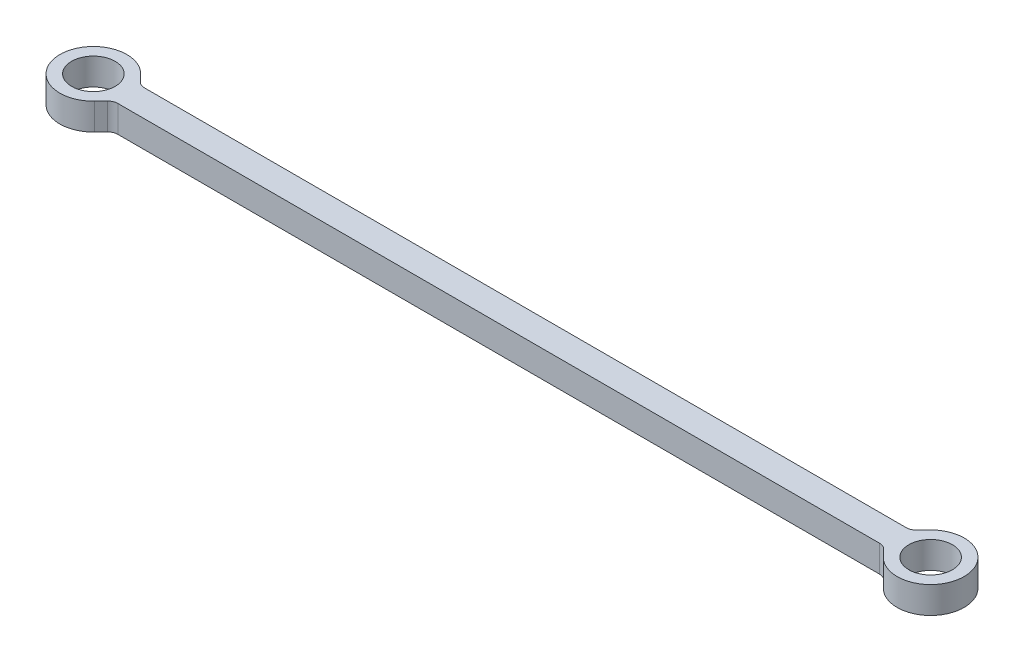
ISO-10303-21;
HEADER;
FILE_DESCRIPTION(('STEP AP214'),'2;1');
FILE_NAME('part.step','',(''),(''),'','','');
FILE_SCHEMA(('AUTOMOTIVE_DESIGN { 1 0 10303 214 1 1 1 1 }'));
ENDSEC;
DATA;
#1=APPLICATION_CONTEXT('core data for automotive mechanical design processes');
#2=APPLICATION_PROTOCOL_DEFINITION('international standard','automotive_design',2000,#1);
#3=PRODUCT_CONTEXT('',#1,'mechanical');
#4=PRODUCT('Part','Part','',(#3));
#5=PRODUCT_RELATED_PRODUCT_CATEGORY('part','',(#4));
#6=PRODUCT_DEFINITION_FORMATION('','',#4);
#7=PRODUCT_DEFINITION_CONTEXT('part definition',#1,'design');
#8=PRODUCT_DEFINITION('design','',#6,#7);
#9=PRODUCT_DEFINITION_SHAPE('','',#8);
#10=(LENGTH_UNIT() NAMED_UNIT(*) SI_UNIT(.MILLI.,.METRE.));
#11=(NAMED_UNIT(*) PLANE_ANGLE_UNIT() SI_UNIT($,.RADIAN.));
#12=(NAMED_UNIT(*) SI_UNIT($,.STERADIAN.) SOLID_ANGLE_UNIT());
#13=UNCERTAINTY_MEASURE_WITH_UNIT(LENGTH_MEASURE(1.E-05),#10,'distance_accuracy_value','');
#14=(GEOMETRIC_REPRESENTATION_CONTEXT(3) GLOBAL_UNCERTAINTY_ASSIGNED_CONTEXT((#13)) GLOBAL_UNIT_ASSIGNED_CONTEXT((#10,
#11,#12)) REPRESENTATION_CONTEXT('',''));
#15=CARTESIAN_POINT('',(0.,0.,0.));
#16=DIRECTION('',(0.,0.,1.));
#17=DIRECTION('',(1.,0.,0.));
#18=AXIS2_PLACEMENT_3D('',#15,#16,#17);
#19=CARTESIAN_POINT('',(0.,8.,0.));
#20=DIRECTION('',(0.,-1.,0.));
#21=DIRECTION('',(0.,0.,-1.));
#22=AXIS2_PLACEMENT_3D('',#19,#20,#21);
#23=CYLINDRICAL_SURFACE('',#22,10.);
#24=CARTESIAN_POINT('',(0.,0.,0.));
#25=DIRECTION('',(0.,-1.,0.));
#26=DIRECTION('',(0.,0.,-1.));
#27=AXIS2_PLACEMENT_3D('',#24,#25,#26);
#28=CIRCLE('',#27,10.);
#29=CARTESIAN_POINT('',(7.24137931034485,0.,6.89655172413791));
#30=VERTEX_POINT('',#29);
#31=CARTESIAN_POINT('',(7.24137931034484,0.,-6.89655172413792));
#32=VERTEX_POINT('',#31);
#33=EDGE_CURVE('E160',#30,#32,#28,.T.);
#34=ORIENTED_EDGE('',*,*,#33,.F.);
#35=DIRECTION('',(0.,-1.,0.));
#36=VECTOR('',#35,1.);
#37=CARTESIAN_POINT('',(7.24137931034485,8.,6.89655172413791));
#38=LINE('',#37,#36);
#39=CARTESIAN_POINT('',(7.24137931034485,8.,6.89655172413791));
#40=VERTEX_POINT('',#39);
#41=EDGE_CURVE('E11',#40,#30,#38,.T.);
#42=ORIENTED_EDGE('',*,*,#41,.F.);
#43=CARTESIAN_POINT('',(0.,8.,0.));
#44=DIRECTION('',(0.,-1.,0.));
#45=DIRECTION('',(0.,0.,-1.));
#46=AXIS2_PLACEMENT_3D('',#43,#44,#45);
#47=CIRCLE('',#46,10.);
#48=CARTESIAN_POINT('',(7.24137931034484,8.,-6.89655172413792));
#49=VERTEX_POINT('',#48);
#50=EDGE_CURVE('E193',#40,#49,#47,.T.);
#51=ORIENTED_EDGE('',*,*,#50,.T.);
#52=DIRECTION('',(0.,-1.,0.));
#53=VECTOR('',#52,1.);
#54=CARTESIAN_POINT('',(7.24137931034484,8.,-6.89655172413792));
#55=LINE('',#54,#53);
#56=EDGE_CURVE('E42',#49,#32,#55,.T.);
#57=ORIENTED_EDGE('',*,*,#56,.T.);
#58=EDGE_LOOP('',(#34,#42,#51,#57));
#59=FACE_BOUND('',#58,.T.);
#60=ADVANCED_FACE('F39',(#59),#23,.T.);
#61=CARTESIAN_POINT('',(9.11330049261083,8.,4.93103448275862));
#62=DIRECTION('',(0.724137931034485,0.,0.689655172413791));
#63=DIRECTION('',(0.689655172413791,0.,-0.724137931034485));
#64=AXIS2_PLACEMENT_3D('',#61,#62,#63);
#65=PLANE('',#64);
#66=DIRECTION('',(-0.689655172413791,0.,0.724137931034485));
#67=VECTOR('',#66,1.);
#68=CARTESIAN_POINT('',(9.11330049261083,0.,4.93103448275862));
#69=LINE('',#68,#67);
#70=CARTESIAN_POINT('',(9.11330049261083,0.,4.93103448275862));
#71=VERTEX_POINT('',#70);
#72=EDGE_CURVE('E191',#71,#30,#69,.T.);
#73=ORIENTED_EDGE('',*,*,#72,.F.);
#74=DIRECTION('',(0.,-1.,0.));
#75=VECTOR('',#74,1.);
#76=CARTESIAN_POINT('',(9.11330049261083,8.,4.93103448275862));
#77=LINE('',#76,#75);
#78=CARTESIAN_POINT('',(9.11330049261083,8.,4.93103448275862));
#79=VERTEX_POINT('',#78);
#80=EDGE_CURVE('E48',#79,#71,#77,.T.);
#81=ORIENTED_EDGE('',*,*,#80,.F.);
#82=DIRECTION('',(-0.689655172413791,0.,0.724137931034485));
#83=VECTOR('',#82,1.);
#84=CARTESIAN_POINT('',(9.11330049261083,8.,4.93103448275862));
#85=LINE('',#84,#83);
#86=EDGE_CURVE('E150',#79,#40,#85,.T.);
#87=ORIENTED_EDGE('',*,*,#86,.T.);
#88=ORIENTED_EDGE('',*,*,#41,.T.);
#89=EDGE_LOOP('',(#73,#81,#87,#88));
#90=FACE_BOUND('',#89,.T.);
#91=ADVANCED_FACE('F213',(#90),#65,.T.);
#92=CARTESIAN_POINT('',(11.2857142857143,8.,7.));
#93=DIRECTION('',(0.,-1.,0.));
#94=DIRECTION('',(0.,0.,-1.));
#95=AXIS2_PLACEMENT_3D('',#92,#93,#94);
#96=CYLINDRICAL_SURFACE('',#95,3.);
#97=CARTESIAN_POINT('',(11.2857142857143,0.,7.));
#98=DIRECTION('',(0.,1.,0.));
#99=DIRECTION('',(0.,0.,1.));
#100=AXIS2_PLACEMENT_3D('',#97,#98,#99);
#101=CIRCLE('',#100,3.);
#102=CARTESIAN_POINT('',(11.2857142857143,0.,4.));
#103=VERTEX_POINT('',#102);
#104=EDGE_CURVE('E137',#103,#71,#101,.T.);
#105=ORIENTED_EDGE('',*,*,#104,.F.);
#106=DIRECTION('',(0.,-1.,0.));
#107=VECTOR('',#106,1.);
#108=CARTESIAN_POINT('',(11.2857142857143,8.,4.));
#109=LINE('',#108,#107);
#110=CARTESIAN_POINT('',(11.2857142857143,8.,4.));
#111=VERTEX_POINT('',#110);
#112=EDGE_CURVE('E132',#111,#103,#109,.T.);
#113=ORIENTED_EDGE('',*,*,#112,.F.);
#114=CARTESIAN_POINT('',(11.2857142857143,8.,7.));
#115=DIRECTION('',(0.,1.,0.));
#116=DIRECTION('',(0.,0.,1.));
#117=AXIS2_PLACEMENT_3D('',#114,#115,#116);
#118=CIRCLE('',#117,3.);
#119=EDGE_CURVE('E135',#111,#79,#118,.T.);
#120=ORIENTED_EDGE('',*,*,#119,.T.);
#121=ORIENTED_EDGE('',*,*,#80,.T.);
#122=EDGE_LOOP('',(#105,#113,#120,#121));
#123=FACE_BOUND('',#122,.T.);
#124=ADVANCED_FACE('F134',(#123),#96,.F.);
#125=CARTESIAN_POINT('',(238.714285714285,8.,4.));
#126=DIRECTION('',(0.,0.,1.));
#127=DIRECTION('',(1.,0.,0.));
#128=AXIS2_PLACEMENT_3D('',#125,#126,#127);
#129=PLANE('',#128);
#130=DIRECTION('',(-1.,0.,0.));
#131=VECTOR('',#130,1.);
#132=CARTESIAN_POINT('',(238.714285714285,0.,4.));
#133=LINE('',#132,#131);
#134=CARTESIAN_POINT('',(238.714285714285,0.,4.));
#135=VERTEX_POINT('',#134);
#136=EDGE_CURVE('E188',#135,#103,#133,.T.);
#137=ORIENTED_EDGE('',*,*,#136,.F.);
#138=DIRECTION('',(0.,-1.,0.));
#139=VECTOR('',#138,1.);
#140=CARTESIAN_POINT('',(238.714285714285,8.,4.));
#141=LINE('',#140,#139);
#142=CARTESIAN_POINT('',(238.714285714285,8.,4.));
#143=VERTEX_POINT('',#142);
#144=EDGE_CURVE('E142',#143,#135,#141,.T.);
#145=ORIENTED_EDGE('',*,*,#144,.F.);
#146=DIRECTION('',(-1.,0.,0.));
#147=VECTOR('',#146,1.);
#148=CARTESIAN_POINT('',(238.714285714285,8.,4.));
#149=LINE('',#148,#147);
#150=EDGE_CURVE('E148',#143,#111,#149,.T.);
#151=ORIENTED_EDGE('',*,*,#150,.T.);
#152=ORIENTED_EDGE('',*,*,#112,.T.);
#153=EDGE_LOOP('',(#137,#145,#151,#152));
#154=FACE_BOUND('',#153,.T.);
#155=ADVANCED_FACE('F152',(#154),#129,.T.);
#156=CARTESIAN_POINT('',(238.714285714286,8.,7.));
#157=DIRECTION('',(0.,-1.,0.));
#158=DIRECTION('',(0.,0.,-1.));
#159=AXIS2_PLACEMENT_3D('',#156,#157,#158);
#160=CYLINDRICAL_SURFACE('',#159,2.99999999999984);
#161=CARTESIAN_POINT('',(238.714285714286,0.,7.));
#162=DIRECTION('',(0.,1.,0.));
#163=DIRECTION('',(0.,0.,1.));
#164=AXIS2_PLACEMENT_3D('',#161,#162,#163);
#165=CIRCLE('',#164,2.99999999999984);
#166=CARTESIAN_POINT('',(240.886699507389,0.,4.93103448275852));
#167=VERTEX_POINT('',#166);
#168=EDGE_CURVE('E185',#167,#135,#165,.T.);
#169=ORIENTED_EDGE('',*,*,#168,.F.);
#170=DIRECTION('',(0.,-1.,0.));
#171=VECTOR('',#170,1.);
#172=CARTESIAN_POINT('',(240.886699507389,8.,4.93103448275852));
#173=LINE('',#172,#171);
#174=CARTESIAN_POINT('',(240.886699507389,8.,4.93103448275852));
#175=VERTEX_POINT('',#174);
#176=EDGE_CURVE('E197',#175,#167,#173,.T.);
#177=ORIENTED_EDGE('',*,*,#176,.F.);
#178=CARTESIAN_POINT('',(238.714285714286,8.,7.));
#179=DIRECTION('',(0.,1.,0.));
#180=DIRECTION('',(0.,0.,1.));
#181=AXIS2_PLACEMENT_3D('',#178,#179,#180);
#182=CIRCLE('',#181,2.99999999999984);
#183=EDGE_CURVE('E153',#175,#143,#182,.T.);
#184=ORIENTED_EDGE('',*,*,#183,.T.);
#185=ORIENTED_EDGE('',*,*,#144,.T.);
#186=EDGE_LOOP('',(#169,#177,#184,#185));
#187=FACE_BOUND('',#186,.T.);
#188=ADVANCED_FACE('F226',(#187),#160,.F.);
#189=CARTESIAN_POINT('',(242.758620689655,8.,6.89655172413791));
#190=DIRECTION('',(-0.724137931034476,0.,0.6896551724138));
#191=DIRECTION('',(0.6896551724138,0.,0.724137931034476));
#192=AXIS2_PLACEMENT_3D('',#189,#190,#191);
#193=PLANE('',#192);
#194=DIRECTION('',(-0.6896551724138,0.,-0.724137931034476));
#195=VECTOR('',#194,1.);
#196=CARTESIAN_POINT('',(242.758620689655,0.,6.89655172413791));
#197=LINE('',#196,#195);
#198=CARTESIAN_POINT('',(242.758620689655,0.,6.89655172413791));
#199=VERTEX_POINT('',#198);
#200=EDGE_CURVE('E182',#199,#167,#197,.T.);
#201=ORIENTED_EDGE('',*,*,#200,.F.);
#202=DIRECTION('',(0.,-1.,0.));
#203=VECTOR('',#202,1.);
#204=CARTESIAN_POINT('',(242.758620689655,8.,6.89655172413791));
#205=LINE('',#204,#203);
#206=CARTESIAN_POINT('',(242.758620689655,8.,6.89655172413791));
#207=VERTEX_POINT('',#206);
#208=EDGE_CURVE('E199',#207,#199,#205,.T.);
#209=ORIENTED_EDGE('',*,*,#208,.F.);
#210=DIRECTION('',(-0.6896551724138,0.,-0.724137931034476));
#211=VECTOR('',#210,1.);
#212=CARTESIAN_POINT('',(242.758620689655,8.,6.89655172413791));
#213=LINE('',#212,#211);
#214=EDGE_CURVE('E155',#207,#175,#213,.T.);
#215=ORIENTED_EDGE('',*,*,#214,.T.);
#216=ORIENTED_EDGE('',*,*,#176,.T.);
#217=EDGE_LOOP('',(#201,#209,#215,#216));
#218=FACE_BOUND('',#217,.T.);
#219=ADVANCED_FACE('F229',(#218),#193,.T.);
#220=CARTESIAN_POINT('',(250.,8.,0.));
#221=DIRECTION('',(0.,-1.,0.));
#222=DIRECTION('',(0.,0.,-1.));
#223=AXIS2_PLACEMENT_3D('',#220,#221,#222);
#224=CYLINDRICAL_SURFACE('',#223,10.0000000000001);
#225=CARTESIAN_POINT('',(250.,0.,0.));
#226=DIRECTION('',(0.,-1.,0.));
#227=DIRECTION('',(0.,0.,-1.));
#228=AXIS2_PLACEMENT_3D('',#225,#226,#227);
#229=CIRCLE('',#228,10.0000000000001);
#230=CARTESIAN_POINT('',(242.758620689655,0.,-6.89655172413791));
#231=VERTEX_POINT('',#230);
#232=EDGE_CURVE('E179',#231,#199,#229,.T.);
#233=ORIENTED_EDGE('',*,*,#232,.F.);
#234=DIRECTION('',(0.,-1.,0.));
#235=VECTOR('',#234,1.);
#236=CARTESIAN_POINT('',(242.758620689655,8.,-6.89655172413791));
#237=LINE('',#236,#235);
#238=CARTESIAN_POINT('',(242.758620689655,8.,-6.89655172413791));
#239=VERTEX_POINT('',#238);
#240=EDGE_CURVE('E201',#239,#231,#237,.T.);
#241=ORIENTED_EDGE('',*,*,#240,.F.);
#242=CARTESIAN_POINT('',(250.,8.,0.));
#243=DIRECTION('',(0.,-1.,0.));
#244=DIRECTION('',(0.,0.,-1.));
#245=AXIS2_PLACEMENT_3D('',#242,#243,#244);
#246=CIRCLE('',#245,10.0000000000001);
#247=EDGE_CURVE('E303',#239,#207,#246,.T.);
#248=ORIENTED_EDGE('',*,*,#247,.T.);
#249=ORIENTED_EDGE('',*,*,#208,.T.);
#250=EDGE_LOOP('',(#233,#241,#248,#249));
#251=FACE_BOUND('',#250,.T.);
#252=ADVANCED_FACE('F233',(#251),#224,.T.);
#253=CARTESIAN_POINT('',(240.886699507389,8.,-4.93103448275864));
#254=DIRECTION('',(-0.724137931034478,0.,-0.689655172413798));
#255=DIRECTION('',(-0.689655172413798,0.,0.724137931034478));
#256=AXIS2_PLACEMENT_3D('',#253,#254,#255);
#257=PLANE('',#256);
#258=DIRECTION('',(0.689655172413798,0.,-0.724137931034478));
#259=VECTOR('',#258,1.);
#260=CARTESIAN_POINT('',(240.886699507389,0.,-4.93103448275864));
#261=LINE('',#260,#259);
#262=CARTESIAN_POINT('',(240.886699507389,0.,-4.93103448275864));
#263=VERTEX_POINT('',#262);
#264=EDGE_CURVE('E176',#263,#231,#261,.T.);
#265=ORIENTED_EDGE('',*,*,#264,.F.);
#266=DIRECTION('',(0.,-1.,0.));
#267=VECTOR('',#266,1.);
#268=CARTESIAN_POINT('',(240.886699507389,8.,-4.93103448275864));
#269=LINE('',#268,#267);
#270=CARTESIAN_POINT('',(240.886699507389,8.,-4.93103448275864));
#271=VERTEX_POINT('',#270);
#272=EDGE_CURVE('E203',#271,#263,#269,.T.);
#273=ORIENTED_EDGE('',*,*,#272,.F.);
#274=DIRECTION('',(0.689655172413798,0.,-0.724137931034478));
#275=VECTOR('',#274,1.);
#276=CARTESIAN_POINT('',(240.886699507389,8.,-4.93103448275864));
#277=LINE('',#276,#275);
#278=EDGE_CURVE('E300',#271,#239,#277,.T.);
#279=ORIENTED_EDGE('',*,*,#278,.T.);
#280=ORIENTED_EDGE('',*,*,#240,.T.);
#281=EDGE_LOOP('',(#265,#273,#279,#280));
#282=FACE_BOUND('',#281,.T.);
#283=ADVANCED_FACE('F237',(#282),#257,.T.);
#284=CARTESIAN_POINT('',(238.714285714286,8.,-7.));
#285=DIRECTION('',(0.,-1.,0.));
#286=DIRECTION('',(0.,0.,-1.));
#287=AXIS2_PLACEMENT_3D('',#284,#285,#286);
#288=CYLINDRICAL_SURFACE('',#287,2.99999999999984);
#289=CARTESIAN_POINT('',(238.714285714286,0.,-7.));
#290=DIRECTION('',(0.,1.,0.));
#291=DIRECTION('',(0.,0.,1.));
#292=AXIS2_PLACEMENT_3D('',#289,#290,#291);
#293=CIRCLE('',#292,2.99999999999984);
#294=CARTESIAN_POINT('',(238.714285714285,0.,-4.00000000000017));
#295=VERTEX_POINT('',#294);
#296=EDGE_CURVE('E173',#295,#263,#293,.T.);
#297=ORIENTED_EDGE('',*,*,#296,.F.);
#298=DIRECTION('',(0.,-1.,0.));
#299=VECTOR('',#298,1.);
#300=CARTESIAN_POINT('',(238.714285714285,8.,-4.00000000000017));
#301=LINE('',#300,#299);
#302=CARTESIAN_POINT('',(238.714285714285,8.,-4.00000000000017));
#303=VERTEX_POINT('',#302);
#304=EDGE_CURVE('E205',#303,#295,#301,.T.);
#305=ORIENTED_EDGE('',*,*,#304,.F.);
#306=CARTESIAN_POINT('',(238.714285714286,8.,-7.));
#307=DIRECTION('',(0.,1.,0.));
#308=DIRECTION('',(0.,0.,1.));
#309=AXIS2_PLACEMENT_3D('',#306,#307,#308);
#310=CIRCLE('',#309,2.99999999999984);
#311=EDGE_CURVE('E297',#303,#271,#310,.T.);
#312=ORIENTED_EDGE('',*,*,#311,.T.);
#313=ORIENTED_EDGE('',*,*,#272,.T.);
#314=EDGE_LOOP('',(#297,#305,#312,#313));
#315=FACE_BOUND('',#314,.T.);
#316=ADVANCED_FACE('F241',(#315),#288,.F.);
#317=CARTESIAN_POINT('',(11.2857142857143,8.,-4.));
#318=DIRECTION('',(0.,0.,-1.));
#319=DIRECTION('',(-1.,0.,0.));
#320=AXIS2_PLACEMENT_3D('',#317,#318,#319);
#321=PLANE('',#320);
#322=DIRECTION('',(1.,0.,0.));
#323=VECTOR('',#322,1.);
#324=CARTESIAN_POINT('',(11.2857142857143,0.,-4.));
#325=LINE('',#324,#323);
#326=CARTESIAN_POINT('',(11.2857142857143,0.,-4.));
#327=VERTEX_POINT('',#326);
#328=EDGE_CURVE('E170',#327,#295,#325,.T.);
#329=ORIENTED_EDGE('',*,*,#328,.F.);
#330=DIRECTION('',(0.,-1.,0.));
#331=VECTOR('',#330,1.);
#332=CARTESIAN_POINT('',(11.2857142857143,8.,-4.));
#333=LINE('',#332,#331);
#334=CARTESIAN_POINT('',(11.2857142857143,8.,-4.));
#335=VERTEX_POINT('',#334);
#336=EDGE_CURVE('E207',#335,#327,#333,.T.);
#337=ORIENTED_EDGE('',*,*,#336,.F.);
#338=DIRECTION('',(1.,0.,0.));
#339=VECTOR('',#338,1.);
#340=CARTESIAN_POINT('',(11.2857142857143,8.,-4.));
#341=LINE('',#340,#339);
#342=EDGE_CURVE('E294',#335,#303,#341,.T.);
#343=ORIENTED_EDGE('',*,*,#342,.T.);
#344=ORIENTED_EDGE('',*,*,#304,.T.);
#345=EDGE_LOOP('',(#329,#337,#343,#344));
#346=FACE_BOUND('',#345,.T.);
#347=ADVANCED_FACE('F245',(#346),#321,.T.);
#348=CARTESIAN_POINT('',(11.2857142857143,8.,-7.));
#349=DIRECTION('',(0.,-1.,0.));
#350=DIRECTION('',(0.,0.,-1.));
#351=AXIS2_PLACEMENT_3D('',#348,#349,#350);
#352=CYLINDRICAL_SURFACE('',#351,3.);
#353=CARTESIAN_POINT('',(11.2857142857143,0.,-7.));
#354=DIRECTION('',(0.,1.,0.));
#355=DIRECTION('',(0.,0.,1.));
#356=AXIS2_PLACEMENT_3D('',#353,#354,#355);
#357=CIRCLE('',#356,3.);
#358=CARTESIAN_POINT('',(9.11330049261083,0.,-4.93103448275863));
#359=VERTEX_POINT('',#358);
#360=EDGE_CURVE('E167',#359,#327,#357,.T.);
#361=ORIENTED_EDGE('',*,*,#360,.F.);
#362=DIRECTION('',(0.,-1.,0.));
#363=VECTOR('',#362,1.);
#364=CARTESIAN_POINT('',(9.11330049261083,8.,-4.93103448275863));
#365=LINE('',#364,#363);
#366=CARTESIAN_POINT('',(9.11330049261083,8.,-4.93103448275863));
#367=VERTEX_POINT('',#366);
#368=EDGE_CURVE('E208',#367,#359,#365,.T.);
#369=ORIENTED_EDGE('',*,*,#368,.F.);
#370=CARTESIAN_POINT('',(11.2857142857143,8.,-7.));
#371=DIRECTION('',(0.,1.,0.));
#372=DIRECTION('',(0.,0.,1.));
#373=AXIS2_PLACEMENT_3D('',#370,#371,#372);
#374=CIRCLE('',#373,3.);
#375=EDGE_CURVE('E291',#367,#335,#374,.T.);
#376=ORIENTED_EDGE('',*,*,#375,.T.);
#377=ORIENTED_EDGE('',*,*,#336,.T.);
#378=EDGE_LOOP('',(#361,#369,#376,#377));
#379=FACE_BOUND('',#378,.T.);
#380=ADVANCED_FACE('F249',(#379),#352,.F.);
#381=CARTESIAN_POINT('',(7.24137931034484,8.,-6.89655172413792));
#382=DIRECTION('',(0.724137931034483,0.,-0.689655172413793));
#383=DIRECTION('',(-0.689655172413793,0.,-0.724137931034483));
#384=AXIS2_PLACEMENT_3D('',#381,#382,#383);
#385=PLANE('',#384);
#386=DIRECTION('',(0.689655172413793,0.,0.724137931034483));
#387=VECTOR('',#386,1.);
#388=CARTESIAN_POINT('',(7.24137931034484,0.,-6.89655172413792));
#389=LINE('',#388,#387);
#390=EDGE_CURVE('E163',#32,#359,#389,.T.);
#391=ORIENTED_EDGE('',*,*,#390,.F.);
#392=ORIENTED_EDGE('',*,*,#56,.F.);
#393=DIRECTION('',(0.689655172413793,0.,0.724137931034483));
#394=VECTOR('',#393,1.);
#395=CARTESIAN_POINT('',(7.24137931034484,8.,-6.89655172413792));
#396=LINE('',#395,#394);
#397=EDGE_CURVE('E289',#49,#367,#396,.T.);
#398=ORIENTED_EDGE('',*,*,#397,.T.);
#399=ORIENTED_EDGE('',*,*,#368,.T.);
#400=EDGE_LOOP('',(#391,#392,#398,#399));
#401=FACE_BOUND('',#400,.T.);
#402=ADVANCED_FACE('F210',(#401),#385,.T.);
#403=CARTESIAN_POINT('',(0.,8.,0.));
#404=DIRECTION('',(0.,-1.,0.));
#405=DIRECTION('',(0.,0.,-1.));
#406=AXIS2_PLACEMENT_3D('',#403,#404,#405);
#407=PLANE('',#406);
#408=CARTESIAN_POINT('',(250.,8.,0.));
#409=DIRECTION('',(0.,-1.,0.));
#410=DIRECTION('',(0.,0.,1.));
#411=AXIS2_PLACEMENT_3D('',#408,#409,#410);
#412=CIRCLE('',#411,6.5);
#413=CARTESIAN_POINT('',(250.,8.,6.5));
#414=VERTEX_POINT('',#413);
#415=EDGE_CURVE('E276',#414,#414,#412,.T.);
#416=ORIENTED_EDGE('',*,*,#415,.T.);
#417=EDGE_LOOP('',(#416));
#418=FACE_BOUND('',#417,.T.);
#419=CARTESIAN_POINT('',(0.,8.,0.));
#420=DIRECTION('',(0.,-1.,0.));
#421=DIRECTION('',(0.,0.,1.));
#422=AXIS2_PLACEMENT_3D('',#419,#420,#421);
#423=CIRCLE('',#422,6.5);
#424=CARTESIAN_POINT('',(0.,8.,6.5));
#425=VERTEX_POINT('',#424);
#426=EDGE_CURVE('E164',#425,#425,#423,.T.);
#427=ORIENTED_EDGE('',*,*,#426,.T.);
#428=EDGE_LOOP('',(#427));
#429=FACE_BOUND('',#428,.T.);
#430=ORIENTED_EDGE('',*,*,#50,.F.);
#431=ORIENTED_EDGE('',*,*,#86,.F.);
#432=ORIENTED_EDGE('',*,*,#119,.F.);
#433=ORIENTED_EDGE('',*,*,#150,.F.);
#434=ORIENTED_EDGE('',*,*,#183,.F.);
#435=ORIENTED_EDGE('',*,*,#214,.F.);
#436=ORIENTED_EDGE('',*,*,#247,.F.);
#437=ORIENTED_EDGE('',*,*,#278,.F.);
#438=ORIENTED_EDGE('',*,*,#311,.F.);
#439=ORIENTED_EDGE('',*,*,#342,.F.);
#440=ORIENTED_EDGE('',*,*,#375,.F.);
#441=ORIENTED_EDGE('',*,*,#397,.F.);
#442=EDGE_LOOP('',(#430,#431,#432,#433,#434,#435,#436,#437,#438,#439,#440,#441));
#443=FACE_BOUND('',#442,.T.);
#444=ADVANCED_FACE('F146',(#418,#429,#443),#407,.F.);
#445=CARTESIAN_POINT('',(0.,0.,0.));
#446=DIRECTION('',(0.,-1.,0.));
#447=DIRECTION('',(0.,0.,-1.));
#448=AXIS2_PLACEMENT_3D('',#445,#446,#447);
#449=PLANE('',#448);
#450=CARTESIAN_POINT('',(250.,0.,0.));
#451=DIRECTION('',(0.,-1.,0.));
#452=DIRECTION('',(0.,0.,1.));
#453=AXIS2_PLACEMENT_3D('',#450,#451,#452);
#454=CIRCLE('',#453,6.5);
#455=CARTESIAN_POINT('',(250.,0.,6.5));
#456=VERTEX_POINT('',#455);
#457=EDGE_CURVE('E279',#456,#456,#454,.T.);
#458=ORIENTED_EDGE('',*,*,#457,.F.);
#459=EDGE_LOOP('',(#458));
#460=FACE_BOUND('',#459,.T.);
#461=CARTESIAN_POINT('',(0.,0.,0.));
#462=DIRECTION('',(0.,-1.,0.));
#463=DIRECTION('',(0.,0.,1.));
#464=AXIS2_PLACEMENT_3D('',#461,#462,#463);
#465=CIRCLE('',#464,6.5);
#466=CARTESIAN_POINT('',(0.,0.,6.5));
#467=VERTEX_POINT('',#466);
#468=EDGE_CURVE('E281',#467,#467,#465,.T.);
#469=ORIENTED_EDGE('',*,*,#468,.F.);
#470=EDGE_LOOP('',(#469));
#471=FACE_BOUND('',#470,.T.);
#472=ORIENTED_EDGE('',*,*,#33,.T.);
#473=ORIENTED_EDGE('',*,*,#390,.T.);
#474=ORIENTED_EDGE('',*,*,#360,.T.);
#475=ORIENTED_EDGE('',*,*,#328,.T.);
#476=ORIENTED_EDGE('',*,*,#296,.T.);
#477=ORIENTED_EDGE('',*,*,#264,.T.);
#478=ORIENTED_EDGE('',*,*,#232,.T.);
#479=ORIENTED_EDGE('',*,*,#200,.T.);
#480=ORIENTED_EDGE('',*,*,#168,.T.);
#481=ORIENTED_EDGE('',*,*,#136,.T.);
#482=ORIENTED_EDGE('',*,*,#104,.T.);
#483=ORIENTED_EDGE('',*,*,#72,.T.);
#484=EDGE_LOOP('',(#472,#473,#474,#475,#476,#477,#478,#479,#480,#481,#482,#483));
#485=FACE_BOUND('',#484,.T.);
#486=ADVANCED_FACE('F212',(#460,#471,#485),#449,.T.);
#487=CARTESIAN_POINT('',(0.,8.,0.));
#488=DIRECTION('',(0.,-1.,0.));
#489=DIRECTION('',(0.,0.,-1.));
#490=AXIS2_PLACEMENT_3D('',#487,#488,#489);
#491=CYLINDRICAL_SURFACE('',#490,6.5);
#492=ORIENTED_EDGE('',*,*,#426,.F.);
#493=EDGE_LOOP('',(#492));
#494=FACE_BOUND('',#493,.T.);
#495=ORIENTED_EDGE('',*,*,#468,.T.);
#496=EDGE_LOOP('',(#495));
#497=FACE_BOUND('',#496,.T.);
#498=ADVANCED_FACE('F261',(#494,#497),#491,.F.);
#499=CARTESIAN_POINT('',(250.,8.,0.));
#500=DIRECTION('',(0.,-1.,0.));
#501=DIRECTION('',(0.,0.,-1.));
#502=AXIS2_PLACEMENT_3D('',#499,#500,#501);
#503=CYLINDRICAL_SURFACE('',#502,6.5);
#504=ORIENTED_EDGE('',*,*,#415,.F.);
#505=EDGE_LOOP('',(#504));
#506=FACE_BOUND('',#505,.T.);
#507=ORIENTED_EDGE('',*,*,#457,.T.);
#508=EDGE_LOOP('',(#507));
#509=FACE_BOUND('',#508,.T.);
#510=ADVANCED_FACE('F268',(#506,#509),#503,.F.);
#511=CLOSED_SHELL('',(#60,#91,#124,#155,#188,#219,#252,#283,#316,#347,#380,#402,#444,#486,#498,#510));
#512=MANIFOLD_SOLID_BREP('B2',#511);
#513=ADVANCED_BREP_SHAPE_REPRESENTATION('',(#18,#512),#14);
#514=SHAPE_DEFINITION_REPRESENTATION(#9,#513);
ENDSEC;
END-ISO-10303-21;
